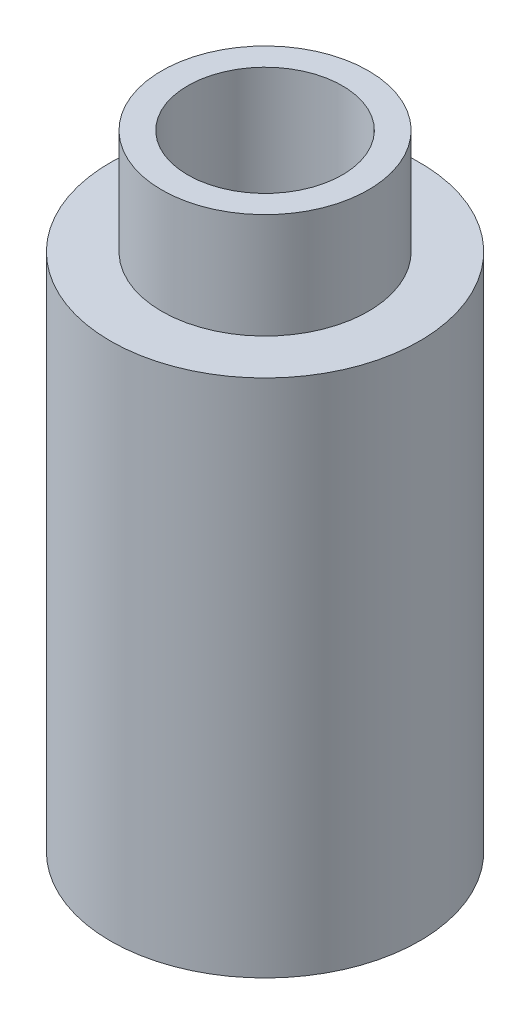
ISO-10303-21;
HEADER;
FILE_DESCRIPTION(('STEP AP214'),'2;1');
FILE_NAME('part.step','',(''),(''),'','','');
FILE_SCHEMA(('AUTOMOTIVE_DESIGN { 1 0 10303 214 1 1 1 1 }'));
ENDSEC;
DATA;
#1=APPLICATION_CONTEXT('core data for automotive mechanical design processes');
#2=APPLICATION_PROTOCOL_DEFINITION('international standard','automotive_design',2000,#1);
#3=PRODUCT_CONTEXT('',#1,'mechanical');
#4=PRODUCT('Part','Part','',(#3));
#5=PRODUCT_RELATED_PRODUCT_CATEGORY('part','',(#4));
#6=PRODUCT_DEFINITION_FORMATION('','',#4);
#7=PRODUCT_DEFINITION_CONTEXT('part definition',#1,'design');
#8=PRODUCT_DEFINITION('design','',#6,#7);
#9=PRODUCT_DEFINITION_SHAPE('','',#8);
#10=(LENGTH_UNIT() NAMED_UNIT(*) SI_UNIT(.MILLI.,.METRE.));
#11=(NAMED_UNIT(*) PLANE_ANGLE_UNIT() SI_UNIT($,.RADIAN.));
#12=(NAMED_UNIT(*) SI_UNIT($,.STERADIAN.) SOLID_ANGLE_UNIT());
#13=UNCERTAINTY_MEASURE_WITH_UNIT(LENGTH_MEASURE(1.E-05),#10,'distance_accuracy_value','');
#14=(GEOMETRIC_REPRESENTATION_CONTEXT(3) GLOBAL_UNCERTAINTY_ASSIGNED_CONTEXT((#13)) GLOBAL_UNIT_ASSIGNED_CONTEXT((#10,
#11,#12)) REPRESENTATION_CONTEXT('',''));
#15=CARTESIAN_POINT('',(0.,0.,0.));
#16=DIRECTION('',(0.,0.,1.));
#17=DIRECTION('',(1.,0.,0.));
#18=AXIS2_PLACEMENT_3D('',#15,#16,#17);
#19=CARTESIAN_POINT('',(0.,31.75,0.));
#20=DIRECTION('',(0.,1.,0.));
#21=DIRECTION('',(0.,0.,1.));
#22=AXIS2_PLACEMENT_3D('',#19,#20,#21);
#23=PLANE('',#22);
#24=CARTESIAN_POINT('',(0.,31.75,0.));
#25=DIRECTION('',(0.,1.,0.));
#26=DIRECTION('',(0.,0.,1.));
#27=AXIS2_PLACEMENT_3D('',#24,#25,#26);
#28=CIRCLE('',#27,9.4488);
#29=CARTESIAN_POINT('',(0.,31.75,9.4488));
#30=VERTEX_POINT('',#29);
#31=EDGE_CURVE('E10',#30,#30,#28,.T.);
#32=ORIENTED_EDGE('',*,*,#31,.T.);
#33=EDGE_LOOP('',(#32));
#34=FACE_BOUND('',#33,.T.);
#35=CARTESIAN_POINT('',(0.,31.75,0.));
#36=DIRECTION('',(0.,1.,0.));
#37=DIRECTION('',(0.,0.,1.));
#38=AXIS2_PLACEMENT_3D('',#35,#36,#37);
#39=CIRCLE('',#38,6.3119);
#40=CARTESIAN_POINT('',(0.,31.75,6.3119));
#41=VERTEX_POINT('',#40);
#42=EDGE_CURVE('E44',#41,#41,#39,.T.);
#43=ORIENTED_EDGE('',*,*,#42,.F.);
#44=EDGE_LOOP('',(#43));
#45=FACE_BOUND('',#44,.T.);
#46=ADVANCED_FACE('F31',(#34,#45),#23,.T.);
#47=CARTESIAN_POINT('',(0.,31.75,0.));
#48=DIRECTION('',(0.,-1.,0.));
#49=DIRECTION('',(0.,0.,-1.));
#50=AXIS2_PLACEMENT_3D('',#47,#48,#49);
#51=CYLINDRICAL_SURFACE('',#50,9.4488);
#52=ORIENTED_EDGE('',*,*,#31,.F.);
#53=EDGE_LOOP('',(#52));
#54=FACE_BOUND('',#53,.T.);
#55=CARTESIAN_POINT('',(0.,0.,0.));
#56=DIRECTION('',(0.,1.,0.));
#57=DIRECTION('',(0.,0.,1.));
#58=AXIS2_PLACEMENT_3D('',#55,#56,#57);
#59=CIRCLE('',#58,9.4488);
#60=CARTESIAN_POINT('',(0.,0.,9.4488));
#61=VERTEX_POINT('',#60);
#62=EDGE_CURVE('E35',#61,#61,#59,.T.);
#63=ORIENTED_EDGE('',*,*,#62,.T.);
#64=EDGE_LOOP('',(#63));
#65=FACE_BOUND('',#64,.T.);
#66=ADVANCED_FACE('F33',(#54,#65),#51,.T.);
#67=CARTESIAN_POINT('',(0.,0.,0.));
#68=DIRECTION('',(0.,1.,0.));
#69=DIRECTION('',(0.,0.,1.));
#70=AXIS2_PLACEMENT_3D('',#67,#68,#69);
#71=PLANE('',#70);
#72=CARTESIAN_POINT('',(0.,0.,0.));
#73=DIRECTION('',(0.,1.,0.));
#74=DIRECTION('',(0.,0.,1.));
#75=AXIS2_PLACEMENT_3D('',#72,#73,#74);
#76=CIRCLE('',#75,4.7244);
#77=CARTESIAN_POINT('',(0.,0.,4.7244));
#78=VERTEX_POINT('',#77);
#79=EDGE_CURVE('E47',#78,#78,#76,.T.);
#80=ORIENTED_EDGE('',*,*,#79,.T.);
#81=EDGE_LOOP('',(#80));
#82=FACE_BOUND('',#81,.T.);
#83=ORIENTED_EDGE('',*,*,#62,.F.);
#84=EDGE_LOOP('',(#83));
#85=FACE_BOUND('',#84,.T.);
#86=ADVANCED_FACE('F56',(#82,#85),#71,.F.);
#87=CARTESIAN_POINT('',(0.,38.1762,0.));
#88=DIRECTION('',(0.,-1.,0.));
#89=DIRECTION('',(0.,0.,-1.));
#90=AXIS2_PLACEMENT_3D('',#87,#88,#89);
#91=CYLINDRICAL_SURFACE('',#90,6.3119);
#92=CARTESIAN_POINT('',(0.,38.1762,0.));
#93=DIRECTION('',(0.,1.,0.));
#94=DIRECTION('',(0.,0.,1.));
#95=AXIS2_PLACEMENT_3D('',#92,#93,#94);
#96=CIRCLE('',#95,6.3119);
#97=CARTESIAN_POINT('',(0.,38.1762,6.3119));
#98=VERTEX_POINT('',#97);
#99=EDGE_CURVE('E42',#98,#98,#96,.T.);
#100=ORIENTED_EDGE('',*,*,#99,.F.);
#101=EDGE_LOOP('',(#100));
#102=FACE_BOUND('',#101,.T.);
#103=ORIENTED_EDGE('',*,*,#42,.T.);
#104=EDGE_LOOP('',(#103));
#105=FACE_BOUND('',#104,.T.);
#106=ADVANCED_FACE('F68',(#102,#105),#91,.T.);
#107=CARTESIAN_POINT('',(0.,38.1762,0.));
#108=DIRECTION('',(0.,1.,0.));
#109=DIRECTION('',(0.,0.,1.));
#110=AXIS2_PLACEMENT_3D('',#107,#108,#109);
#111=PLANE('',#110);
#112=CARTESIAN_POINT('',(0.,38.1762,0.));
#113=DIRECTION('',(0.,1.,0.));
#114=DIRECTION('',(0.,0.,1.));
#115=AXIS2_PLACEMENT_3D('',#112,#113,#114);
#116=CIRCLE('',#115,4.7244);
#117=CARTESIAN_POINT('',(0.,38.1762,4.7244));
#118=VERTEX_POINT('',#117);
#119=EDGE_CURVE('E50',#118,#118,#116,.T.);
#120=ORIENTED_EDGE('',*,*,#119,.F.);
#121=EDGE_LOOP('',(#120));
#122=FACE_BOUND('',#121,.T.);
#123=ORIENTED_EDGE('',*,*,#99,.T.);
#124=EDGE_LOOP('',(#123));
#125=FACE_BOUND('',#124,.T.);
#126=ADVANCED_FACE('F62',(#122,#125),#111,.T.);
#127=CARTESIAN_POINT('',(0.,0.,0.));
#128=DIRECTION('',(0.,1.,0.));
#129=DIRECTION('',(0.,0.,1.));
#130=AXIS2_PLACEMENT_3D('',#127,#128,#129);
#131=CYLINDRICAL_SURFACE('',#130,4.7244);
#132=ORIENTED_EDGE('',*,*,#79,.F.);
#133=EDGE_LOOP('',(#132));
#134=FACE_BOUND('',#133,.T.);
#135=ORIENTED_EDGE('',*,*,#119,.T.);
#136=EDGE_LOOP('',(#135));
#137=FACE_BOUND('',#136,.T.);
#138=ADVANCED_FACE('F59',(#134,#137),#131,.F.);
#139=CLOSED_SHELL('',(#46,#66,#86,#106,#126,#138));
#140=MANIFOLD_SOLID_BREP('B2',#139);
#141=ADVANCED_BREP_SHAPE_REPRESENTATION('',(#18,#140),#14);
#142=SHAPE_DEFINITION_REPRESENTATION(#9,#141);
ENDSEC;
END-ISO-10303-21;
